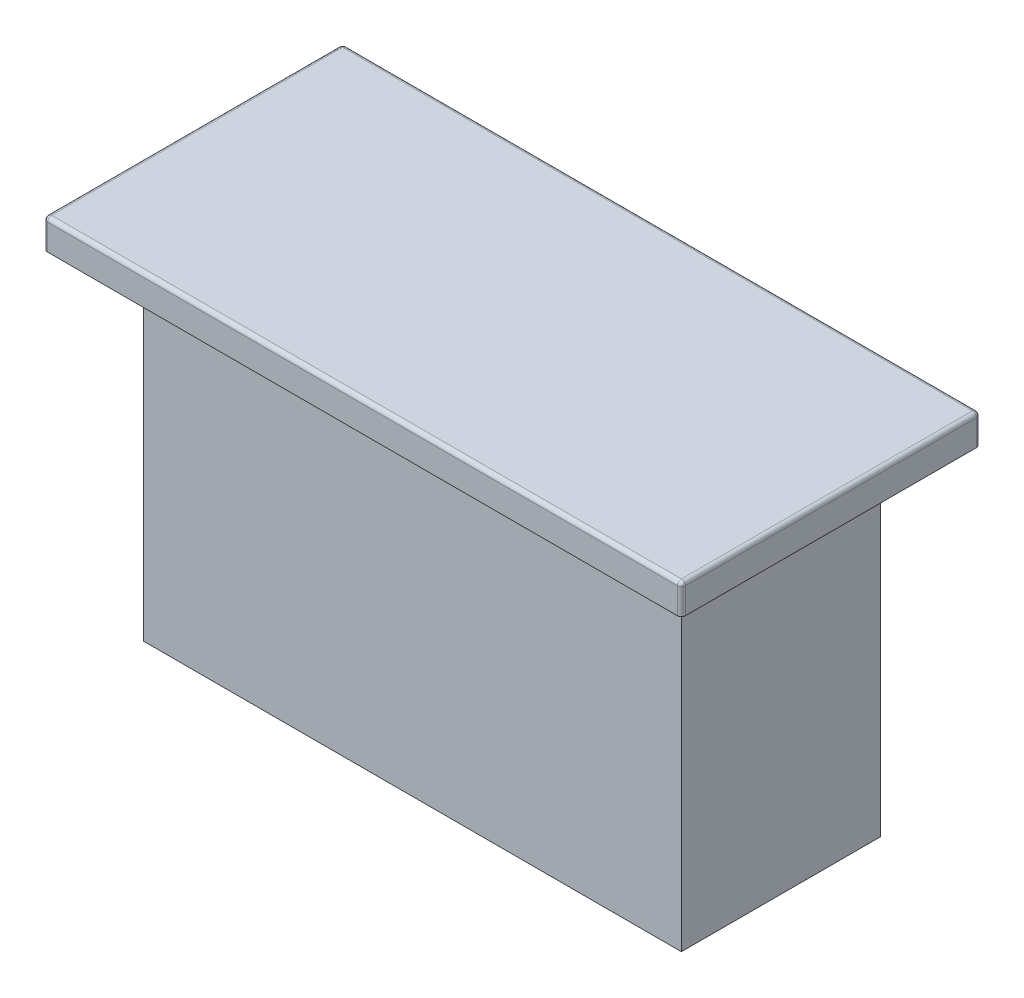
ISO-10303-21;
HEADER;
FILE_DESCRIPTION(('STEP AP214'),'2;1');
FILE_NAME('part.step','',(''),(''),'','','');
FILE_SCHEMA(('AUTOMOTIVE_DESIGN { 1 0 10303 214 1 1 1 1 }'));
ENDSEC;
DATA;
#1=APPLICATION_CONTEXT('core data for automotive mechanical design processes');
#2=APPLICATION_PROTOCOL_DEFINITION('international standard','automotive_design',2000,#1);
#3=PRODUCT_CONTEXT('',#1,'mechanical');
#4=PRODUCT('Part','Part','',(#3));
#5=PRODUCT_RELATED_PRODUCT_CATEGORY('part','',(#4));
#6=PRODUCT_DEFINITION_FORMATION('','',#4);
#7=PRODUCT_DEFINITION_CONTEXT('part definition',#1,'design');
#8=PRODUCT_DEFINITION('design','',#6,#7);
#9=PRODUCT_DEFINITION_SHAPE('','',#8);
#10=(LENGTH_UNIT() NAMED_UNIT(*) SI_UNIT(.MILLI.,.METRE.));
#11=(NAMED_UNIT(*) PLANE_ANGLE_UNIT() SI_UNIT($,.RADIAN.));
#12=(NAMED_UNIT(*) SI_UNIT($,.STERADIAN.) SOLID_ANGLE_UNIT());
#13=UNCERTAINTY_MEASURE_WITH_UNIT(LENGTH_MEASURE(1.E-05),#10,'distance_accuracy_value','');
#14=(GEOMETRIC_REPRESENTATION_CONTEXT(3) GLOBAL_UNCERTAINTY_ASSIGNED_CONTEXT((#13)) GLOBAL_UNIT_ASSIGNED_CONTEXT((#10,
#11,#12)) REPRESENTATION_CONTEXT('',''));
#15=CARTESIAN_POINT('',(0.,0.,0.));
#16=DIRECTION('',(0.,0.,1.));
#17=DIRECTION('',(1.,0.,0.));
#18=AXIS2_PLACEMENT_3D('',#15,#16,#17);
#19=CARTESIAN_POINT('',(0.,1.5,0.));
#20=DIRECTION('',(-1.,0.,0.));
#21=DIRECTION('',(0.,0.,1.));
#22=AXIS2_PLACEMENT_3D('',#19,#20,#21);
#23=PLANE('',#22);
#24=DIRECTION('',(0.,0.,-1.));
#25=VECTOR('',#24,1.);
#26=CARTESIAN_POINT('',(0.,0.,0.));
#27=LINE('',#26,#25);
#28=CARTESIAN_POINT('',(0.,0.,-0.2));
#29=VERTEX_POINT('',#28);
#30=CARTESIAN_POINT('',(0.,0.,-14.8));
#31=VERTEX_POINT('',#30);
#32=EDGE_CURVE('E166',#29,#31,#27,.T.);
#33=ORIENTED_EDGE('',*,*,#32,.T.);
#34=DIRECTION('',(0.,-1.,0.));
#35=VECTOR('',#34,1.);
#36=CARTESIAN_POINT('',(0.,1.5,-14.8));
#37=LINE('',#36,#35);
#38=CARTESIAN_POINT('',(0.,1.3,-14.8));
#39=VERTEX_POINT('',#38);
#40=EDGE_CURVE('E56',#31,#39,#37,.F.);
#41=ORIENTED_EDGE('',*,*,#40,.T.);
#42=DIRECTION('',(0.,0.,-1.));
#43=VECTOR('',#42,1.);
#44=CARTESIAN_POINT('',(0.,1.3,0.));
#45=LINE('',#44,#43);
#46=CARTESIAN_POINT('',(0.,1.3,-0.2));
#47=VERTEX_POINT('',#46);
#48=EDGE_CURVE('E208',#39,#47,#45,.F.);
#49=ORIENTED_EDGE('',*,*,#48,.T.);
#50=DIRECTION('',(0.,-1.,0.));
#51=VECTOR('',#50,1.);
#52=CARTESIAN_POINT('',(0.,1.5,-0.2));
#53=LINE('',#52,#51);
#54=EDGE_CURVE('E206',#47,#29,#53,.T.);
#55=ORIENTED_EDGE('',*,*,#54,.T.);
#56=EDGE_LOOP('',(#33,#41,#49,#55));
#57=FACE_BOUND('',#56,.T.);
#58=ADVANCED_FACE('F33',(#57),#23,.F.);
#59=CARTESIAN_POINT('',(0.,1.5,-15.));
#60=DIRECTION('',(0.,0.,1.));
#61=DIRECTION('',(1.,0.,0.));
#62=AXIS2_PLACEMENT_3D('',#59,#60,#61);
#63=PLANE('',#62);
#64=DIRECTION('',(-1.,0.,0.));
#65=VECTOR('',#64,1.);
#66=CARTESIAN_POINT('',(0.,0.,-15.));
#67=LINE('',#66,#65);
#68=CARTESIAN_POINT('',(-0.2,0.,-15.));
#69=VERTEX_POINT('',#68);
#70=CARTESIAN_POINT('',(-31.8,0.,-15.));
#71=VERTEX_POINT('',#70);
#72=EDGE_CURVE('E168',#69,#71,#67,.T.);
#73=ORIENTED_EDGE('',*,*,#72,.T.);
#74=DIRECTION('',(0.,-1.,0.));
#75=VECTOR('',#74,1.);
#76=CARTESIAN_POINT('',(-31.8,1.5,-15.));
#77=LINE('',#76,#75);
#78=CARTESIAN_POINT('',(-31.8,1.3,-15.));
#79=VERTEX_POINT('',#78);
#80=EDGE_CURVE('E204',#71,#79,#77,.F.);
#81=ORIENTED_EDGE('',*,*,#80,.T.);
#82=DIRECTION('',(-1.,0.,0.));
#83=VECTOR('',#82,1.);
#84=CARTESIAN_POINT('',(0.,1.3,-15.));
#85=LINE('',#84,#83);
#86=CARTESIAN_POINT('',(-0.2,1.3,-15.));
#87=VERTEX_POINT('',#86);
#88=EDGE_CURVE('E202',#79,#87,#85,.F.);
#89=ORIENTED_EDGE('',*,*,#88,.T.);
#90=DIRECTION('',(0.,-1.,0.));
#91=VECTOR('',#90,1.);
#92=CARTESIAN_POINT('',(-0.2,1.5,-15.));
#93=LINE('',#92,#91);
#94=EDGE_CURVE('E200',#87,#69,#93,.T.);
#95=ORIENTED_EDGE('',*,*,#94,.T.);
#96=EDGE_LOOP('',(#73,#81,#89,#95));
#97=FACE_BOUND('',#96,.T.);
#98=ADVANCED_FACE('F271',(#97),#63,.F.);
#99=CARTESIAN_POINT('',(-32.,1.5,0.));
#100=DIRECTION('',(1.,0.,0.));
#101=DIRECTION('',(0.,0.,-1.));
#102=AXIS2_PLACEMENT_3D('',#99,#100,#101);
#103=PLANE('',#102);
#104=DIRECTION('',(0.,0.,1.));
#105=VECTOR('',#104,1.);
#106=CARTESIAN_POINT('',(-32.,1.3,-15.));
#107=LINE('',#106,#105);
#108=CARTESIAN_POINT('',(-32.,1.3,-0.199999999999994));
#109=VERTEX_POINT('',#108);
#110=CARTESIAN_POINT('',(-32.,1.3,-14.8));
#111=VERTEX_POINT('',#110);
#112=EDGE_CURVE('E196',#109,#111,#107,.F.);
#113=ORIENTED_EDGE('',*,*,#112,.T.);
#114=DIRECTION('',(0.,-1.,0.));
#115=VECTOR('',#114,1.);
#116=CARTESIAN_POINT('',(-32.,1.5,-14.8));
#117=LINE('',#116,#115);
#118=CARTESIAN_POINT('',(-32.,0.,-14.8));
#119=VERTEX_POINT('',#118);
#120=EDGE_CURVE('E198',#111,#119,#117,.T.);
#121=ORIENTED_EDGE('',*,*,#120,.T.);
#122=DIRECTION('',(0.,0.,1.));
#123=VECTOR('',#122,1.);
#124=CARTESIAN_POINT('',(-32.,0.,0.));
#125=LINE('',#124,#123);
#126=CARTESIAN_POINT('',(-32.,0.,-0.199999999999994));
#127=VERTEX_POINT('',#126);
#128=EDGE_CURVE('E172',#119,#127,#125,.T.);
#129=ORIENTED_EDGE('',*,*,#128,.T.);
#130=DIRECTION('',(0.,-1.,0.));
#131=VECTOR('',#130,1.);
#132=CARTESIAN_POINT('',(-32.,1.5,-0.199999999999994));
#133=LINE('',#132,#131);
#134=EDGE_CURVE('E194',#127,#109,#133,.F.);
#135=ORIENTED_EDGE('',*,*,#134,.T.);
#136=EDGE_LOOP('',(#113,#121,#129,#135));
#137=FACE_BOUND('',#136,.T.);
#138=ADVANCED_FACE('F276',(#137),#103,.F.);
#139=CARTESIAN_POINT('',(0.,1.5,0.));
#140=DIRECTION('',(0.,0.,-1.));
#141=DIRECTION('',(-1.,0.,0.));
#142=AXIS2_PLACEMENT_3D('',#139,#140,#141);
#143=PLANE('',#142);
#144=DIRECTION('',(1.,0.,0.));
#145=VECTOR('',#144,1.);
#146=CARTESIAN_POINT('',(-32.,1.3,0.));
#147=LINE('',#146,#145);
#148=CARTESIAN_POINT('',(-0.2,1.3,0.));
#149=VERTEX_POINT('',#148);
#150=CARTESIAN_POINT('',(-31.8,1.3,0.));
#151=VERTEX_POINT('',#150);
#152=EDGE_CURVE('E189',#149,#151,#147,.F.);
#153=ORIENTED_EDGE('',*,*,#152,.T.);
#154=DIRECTION('',(0.,-1.,0.));
#155=VECTOR('',#154,1.);
#156=CARTESIAN_POINT('',(-31.8,1.5,0.));
#157=LINE('',#156,#155);
#158=CARTESIAN_POINT('',(-31.8,0.,0.));
#159=VERTEX_POINT('',#158);
#160=EDGE_CURVE('E192',#151,#159,#157,.T.);
#161=ORIENTED_EDGE('',*,*,#160,.T.);
#162=DIRECTION('',(1.,0.,0.));
#163=VECTOR('',#162,1.);
#164=CARTESIAN_POINT('',(0.,0.,0.));
#165=LINE('',#164,#163);
#166=CARTESIAN_POINT('',(-0.2,0.,0.));
#167=VERTEX_POINT('',#166);
#168=EDGE_CURVE('E175',#159,#167,#165,.T.);
#169=ORIENTED_EDGE('',*,*,#168,.T.);
#170=DIRECTION('',(0.,-1.,0.));
#171=VECTOR('',#170,1.);
#172=CARTESIAN_POINT('',(-0.2,1.5,0.));
#173=LINE('',#172,#171);
#174=EDGE_CURVE('E187',#167,#149,#173,.F.);
#175=ORIENTED_EDGE('',*,*,#174,.T.);
#176=EDGE_LOOP('',(#153,#161,#169,#175));
#177=FACE_BOUND('',#176,.T.);
#178=ADVANCED_FACE('F360',(#177),#143,.F.);
#179=CARTESIAN_POINT('',(0.,1.5,0.));
#180=DIRECTION('',(0.,1.,0.));
#181=DIRECTION('',(0.,0.,1.));
#182=AXIS2_PLACEMENT_3D('',#179,#180,#181);
#183=PLANE('',#182);
#184=DIRECTION('',(0.,0.,1.));
#185=VECTOR('',#184,1.);
#186=CARTESIAN_POINT('',(-31.8,1.5,0.));
#187=LINE('',#186,#185);
#188=CARTESIAN_POINT('',(-31.8,1.5,-14.8));
#189=VERTEX_POINT('',#188);
#190=CARTESIAN_POINT('',(-31.8,1.5,-0.199999999999994));
#191=VERTEX_POINT('',#190);
#192=EDGE_CURVE('E182',#189,#191,#187,.T.);
#193=ORIENTED_EDGE('',*,*,#192,.T.);
#194=DIRECTION('',(1.,0.,0.));
#195=VECTOR('',#194,1.);
#196=CARTESIAN_POINT('',(0.,1.5,-0.2));
#197=LINE('',#196,#195);
#198=CARTESIAN_POINT('',(-0.2,1.5,-0.2));
#199=VERTEX_POINT('',#198);
#200=EDGE_CURVE('E184',#191,#199,#197,.T.);
#201=ORIENTED_EDGE('',*,*,#200,.T.);
#202=DIRECTION('',(0.,0.,-1.));
#203=VECTOR('',#202,1.);
#204=CARTESIAN_POINT('',(-0.2,1.5,-15.));
#205=LINE('',#204,#203);
#206=CARTESIAN_POINT('',(-0.2,1.5,-14.8));
#207=VERTEX_POINT('',#206);
#208=EDGE_CURVE('E178',#199,#207,#205,.T.);
#209=ORIENTED_EDGE('',*,*,#208,.T.);
#210=DIRECTION('',(-1.,0.,0.));
#211=VECTOR('',#210,1.);
#212=CARTESIAN_POINT('',(-32.,1.5,-14.8));
#213=LINE('',#212,#211);
#214=EDGE_CURVE('E180',#207,#189,#213,.T.);
#215=ORIENTED_EDGE('',*,*,#214,.T.);
#216=EDGE_LOOP('',(#193,#201,#209,#215));
#217=FACE_BOUND('',#216,.T.);
#218=ADVANCED_FACE('F348',(#217),#183,.T.);
#219=CARTESIAN_POINT('',(0.,0.,0.));
#220=DIRECTION('',(0.,1.,0.));
#221=DIRECTION('',(0.,0.,1.));
#222=AXIS2_PLACEMENT_3D('',#219,#220,#221);
#223=PLANE('',#222);
#224=DIRECTION('',(0.,0.,-1.));
#225=VECTOR('',#224,1.);
#226=CARTESIAN_POINT('',(-2.5,0.,0.));
#227=LINE('',#226,#225);
#228=CARTESIAN_POINT('',(-2.5,0.,-2.5));
#229=VERTEX_POINT('',#228);
#230=CARTESIAN_POINT('',(-2.5,0.,-12.5));
#231=VERTEX_POINT('',#230);
#232=EDGE_CURVE('E41',#229,#231,#227,.T.);
#233=ORIENTED_EDGE('',*,*,#232,.T.);
#234=DIRECTION('',(-1.,0.,0.));
#235=VECTOR('',#234,1.);
#236=CARTESIAN_POINT('',(0.,0.,-12.5));
#237=LINE('',#236,#235);
#238=CARTESIAN_POINT('',(-29.5,0.,-12.5));
#239=VERTEX_POINT('',#238);
#240=EDGE_CURVE('E11',#231,#239,#237,.T.);
#241=ORIENTED_EDGE('',*,*,#240,.T.);
#242=DIRECTION('',(0.,0.,1.));
#243=VECTOR('',#242,1.);
#244=CARTESIAN_POINT('',(-29.5,0.,0.));
#245=LINE('',#244,#243);
#246=CARTESIAN_POINT('',(-29.5,0.,-2.49999999999999));
#247=VERTEX_POINT('',#246);
#248=EDGE_CURVE('E138',#239,#247,#245,.T.);
#249=ORIENTED_EDGE('',*,*,#248,.T.);
#250=DIRECTION('',(1.,0.,0.));
#251=VECTOR('',#250,1.);
#252=CARTESIAN_POINT('',(0.,0.,-2.5));
#253=LINE('',#252,#251);
#254=EDGE_CURVE('E252',#247,#229,#253,.T.);
#255=ORIENTED_EDGE('',*,*,#254,.T.);
#256=EDGE_LOOP('',(#233,#241,#249,#255));
#257=FACE_BOUND('',#256,.T.);
#258=ORIENTED_EDGE('',*,*,#128,.F.);
#259=CARTESIAN_POINT('',(-31.8,0.,-14.8));
#260=DIRECTION('',(0.,1.,0.));
#261=DIRECTION('',(0.,0.,1.));
#262=AXIS2_PLACEMENT_3D('',#259,#260,#261);
#263=CIRCLE('',#262,0.2);
#264=EDGE_CURVE('E217',#119,#71,#263,.F.);
#265=ORIENTED_EDGE('',*,*,#264,.T.);
#266=ORIENTED_EDGE('',*,*,#72,.F.);
#267=CARTESIAN_POINT('',(-0.2,0.,-14.8));
#268=DIRECTION('',(0.,1.,0.));
#269=DIRECTION('',(0.,0.,1.));
#270=AXIS2_PLACEMENT_3D('',#267,#268,#269);
#271=CIRCLE('',#270,0.2);
#272=EDGE_CURVE('E213',#69,#31,#271,.F.);
#273=ORIENTED_EDGE('',*,*,#272,.T.);
#274=ORIENTED_EDGE('',*,*,#32,.F.);
#275=CARTESIAN_POINT('',(-0.2,0.,-0.2));
#276=DIRECTION('',(0.,1.,0.));
#277=DIRECTION('',(0.,0.,1.));
#278=AXIS2_PLACEMENT_3D('',#275,#276,#277);
#279=CIRCLE('',#278,0.2);
#280=EDGE_CURVE('E211',#29,#167,#279,.F.);
#281=ORIENTED_EDGE('',*,*,#280,.T.);
#282=ORIENTED_EDGE('',*,*,#168,.F.);
#283=CARTESIAN_POINT('',(-31.8,0.,-0.199999999999994));
#284=DIRECTION('',(0.,1.,0.));
#285=DIRECTION('',(0.,0.,1.));
#286=AXIS2_PLACEMENT_3D('',#283,#284,#285);
#287=CIRCLE('',#286,0.2);
#288=EDGE_CURVE('E215',#159,#127,#287,.F.);
#289=ORIENTED_EDGE('',*,*,#288,.T.);
#290=EDGE_LOOP('',(#258,#265,#266,#273,#274,#281,#282,#289));
#291=FACE_BOUND('',#290,.T.);
#292=ADVANCED_FACE('F256',(#257,#291),#223,.F.);
#293=CARTESIAN_POINT('',(-31.8,1.5,-14.8));
#294=DIRECTION('',(0.,-1.,0.));
#295=DIRECTION('',(0.,0.,-1.));
#296=AXIS2_PLACEMENT_3D('',#293,#294,#295);
#297=CYLINDRICAL_SURFACE('',#296,0.2);
#298=ORIENTED_EDGE('',*,*,#264,.F.);
#299=ORIENTED_EDGE('',*,*,#120,.F.);
#300=CARTESIAN_POINT('',(-31.8,1.3,-14.8));
#301=DIRECTION('',(0.,1.,0.));
#302=DIRECTION('',(0.,0.,1.));
#303=AXIS2_PLACEMENT_3D('',#300,#301,#302);
#304=CIRCLE('',#303,0.2);
#305=EDGE_CURVE('E169',#79,#111,#304,.T.);
#306=ORIENTED_EDGE('',*,*,#305,.F.);
#307=ORIENTED_EDGE('',*,*,#80,.F.);
#308=EDGE_LOOP('',(#298,#299,#306,#307));
#309=FACE_BOUND('',#308,.T.);
#310=ADVANCED_FACE('F35',(#309),#297,.T.);
#311=CARTESIAN_POINT('',(0.,1.3,-14.8));
#312=DIRECTION('',(1.,0.,0.));
#313=DIRECTION('',(0.,0.,-1.));
#314=AXIS2_PLACEMENT_3D('',#311,#312,#313);
#315=CYLINDRICAL_SURFACE('',#314,0.2);
#316=CARTESIAN_POINT('',(-0.2,1.3,-14.8));
#317=DIRECTION('',(1.,0.,0.));
#318=DIRECTION('',(0.,0.,-1.));
#319=AXIS2_PLACEMENT_3D('',#316,#317,#318);
#320=CIRCLE('',#319,0.2);
#321=EDGE_CURVE('E243',#87,#207,#320,.T.);
#322=ORIENTED_EDGE('',*,*,#321,.F.);
#323=ORIENTED_EDGE('',*,*,#88,.F.);
#324=CARTESIAN_POINT('',(-31.8,1.3,-14.8));
#325=DIRECTION('',(-1.,0.,0.));
#326=DIRECTION('',(0.,0.,1.));
#327=AXIS2_PLACEMENT_3D('',#324,#325,#326);
#328=CIRCLE('',#327,0.2);
#329=EDGE_CURVE('E246',#189,#79,#328,.T.);
#330=ORIENTED_EDGE('',*,*,#329,.F.);
#331=ORIENTED_EDGE('',*,*,#214,.F.);
#332=EDGE_LOOP('',(#322,#323,#330,#331));
#333=FACE_BOUND('',#332,.T.);
#334=ADVANCED_FACE('F319',(#333),#315,.T.);
#335=CARTESIAN_POINT('',(-0.2,1.5,-14.8));
#336=DIRECTION('',(0.,-1.,0.));
#337=DIRECTION('',(0.,0.,-1.));
#338=AXIS2_PLACEMENT_3D('',#335,#336,#337);
#339=CYLINDRICAL_SURFACE('',#338,0.2);
#340=ORIENTED_EDGE('',*,*,#272,.F.);
#341=ORIENTED_EDGE('',*,*,#94,.F.);
#342=CARTESIAN_POINT('',(-0.2,1.3,-14.8));
#343=DIRECTION('',(0.,1.,0.));
#344=DIRECTION('',(0.,0.,1.));
#345=AXIS2_PLACEMENT_3D('',#342,#343,#344);
#346=CIRCLE('',#345,0.2);
#347=EDGE_CURVE('E240',#39,#87,#346,.T.);
#348=ORIENTED_EDGE('',*,*,#347,.F.);
#349=ORIENTED_EDGE('',*,*,#40,.F.);
#350=EDGE_LOOP('',(#340,#341,#348,#349));
#351=FACE_BOUND('',#350,.T.);
#352=ADVANCED_FACE('F316',(#351),#339,.T.);
#353=CARTESIAN_POINT('',(-31.8,1.3,-14.8));
#354=DIRECTION('',(0.,0.,1.));
#355=DIRECTION('',(1.,0.,0.));
#356=AXIS2_PLACEMENT_3D('',#353,#354,#355);
#357=SPHERICAL_SURFACE('',#356,0.2);
#358=ORIENTED_EDGE('',*,*,#329,.T.);
#359=ORIENTED_EDGE('',*,*,#305,.T.);
#360=CARTESIAN_POINT('',(-31.8,1.3,-14.8));
#361=DIRECTION('',(0.,0.,-1.));
#362=DIRECTION('',(-1.,0.,0.));
#363=AXIS2_PLACEMENT_3D('',#360,#361,#362);
#364=CIRCLE('',#363,0.2);
#365=EDGE_CURVE('E237',#189,#111,#364,.F.);
#366=ORIENTED_EDGE('',*,*,#365,.F.);
#367=EDGE_LOOP('',(#358,#359,#366));
#368=FACE_BOUND('',#367,.T.);
#369=ADVANCED_FACE('F312',(#368),#357,.T.);
#370=CARTESIAN_POINT('',(-0.2,1.3,-14.8));
#371=DIRECTION('',(0.,0.,1.));
#372=DIRECTION('',(1.,0.,0.));
#373=AXIS2_PLACEMENT_3D('',#370,#371,#372);
#374=SPHERICAL_SURFACE('',#373,0.2);
#375=ORIENTED_EDGE('',*,*,#347,.T.);
#376=ORIENTED_EDGE('',*,*,#321,.T.);
#377=CARTESIAN_POINT('',(-0.2,1.3,-14.8));
#378=DIRECTION('',(0.,0.,-1.));
#379=DIRECTION('',(-1.,0.,0.));
#380=AXIS2_PLACEMENT_3D('',#377,#378,#379);
#381=CIRCLE('',#380,0.2);
#382=EDGE_CURVE('E234',#39,#207,#381,.F.);
#383=ORIENTED_EDGE('',*,*,#382,.F.);
#384=EDGE_LOOP('',(#375,#376,#383));
#385=FACE_BOUND('',#384,.T.);
#386=ADVANCED_FACE('F308',(#385),#374,.T.);
#387=CARTESIAN_POINT('',(-31.8,1.5,-0.199999999999994));
#388=DIRECTION('',(0.,-1.,0.));
#389=DIRECTION('',(0.,0.,-1.));
#390=AXIS2_PLACEMENT_3D('',#387,#388,#389);
#391=CYLINDRICAL_SURFACE('',#390,0.2);
#392=ORIENTED_EDGE('',*,*,#288,.F.);
#393=ORIENTED_EDGE('',*,*,#160,.F.);
#394=CARTESIAN_POINT('',(-31.8,1.3,-0.199999999999994));
#395=DIRECTION('',(0.,1.,0.));
#396=DIRECTION('',(0.,0.,1.));
#397=AXIS2_PLACEMENT_3D('',#394,#395,#396);
#398=CIRCLE('',#397,0.2);
#399=EDGE_CURVE('E231',#109,#151,#398,.T.);
#400=ORIENTED_EDGE('',*,*,#399,.F.);
#401=ORIENTED_EDGE('',*,*,#134,.F.);
#402=EDGE_LOOP('',(#392,#393,#400,#401));
#403=FACE_BOUND('',#402,.T.);
#404=ADVANCED_FACE('F304',(#403),#391,.T.);
#405=CARTESIAN_POINT('',(-31.8,1.3,0.));
#406=DIRECTION('',(0.,0.,-1.));
#407=DIRECTION('',(-1.,0.,0.));
#408=AXIS2_PLACEMENT_3D('',#405,#406,#407);
#409=CYLINDRICAL_SURFACE('',#408,0.2);
#410=ORIENTED_EDGE('',*,*,#365,.T.);
#411=ORIENTED_EDGE('',*,*,#112,.F.);
#412=CARTESIAN_POINT('',(-31.8,1.3,-0.199999999999994));
#413=DIRECTION('',(0.,0.,1.));
#414=DIRECTION('',(1.,0.,0.));
#415=AXIS2_PLACEMENT_3D('',#412,#413,#414);
#416=CIRCLE('',#415,0.2);
#417=EDGE_CURVE('E228',#191,#109,#416,.T.);
#418=ORIENTED_EDGE('',*,*,#417,.F.);
#419=ORIENTED_EDGE('',*,*,#192,.F.);
#420=EDGE_LOOP('',(#410,#411,#418,#419));
#421=FACE_BOUND('',#420,.T.);
#422=ADVANCED_FACE('F300',(#421),#409,.T.);
#423=CARTESIAN_POINT('',(-0.2,1.3,0.));
#424=DIRECTION('',(0.,0.,1.));
#425=DIRECTION('',(1.,0.,0.));
#426=AXIS2_PLACEMENT_3D('',#423,#424,#425);
#427=CYLINDRICAL_SURFACE('',#426,0.2);
#428=ORIENTED_EDGE('',*,*,#382,.T.);
#429=ORIENTED_EDGE('',*,*,#208,.F.);
#430=CARTESIAN_POINT('',(-0.2,1.3,-0.2));
#431=DIRECTION('',(0.,0.,1.));
#432=DIRECTION('',(1.,0.,0.));
#433=AXIS2_PLACEMENT_3D('',#430,#431,#432);
#434=CIRCLE('',#433,0.2);
#435=EDGE_CURVE('E225',#47,#199,#434,.T.);
#436=ORIENTED_EDGE('',*,*,#435,.F.);
#437=ORIENTED_EDGE('',*,*,#48,.F.);
#438=EDGE_LOOP('',(#428,#429,#436,#437));
#439=FACE_BOUND('',#438,.T.);
#440=ADVANCED_FACE('F296',(#439),#427,.T.);
#441=CARTESIAN_POINT('',(-0.2,1.5,-0.2));
#442=DIRECTION('',(0.,-1.,0.));
#443=DIRECTION('',(0.,0.,-1.));
#444=AXIS2_PLACEMENT_3D('',#441,#442,#443);
#445=CYLINDRICAL_SURFACE('',#444,0.2);
#446=ORIENTED_EDGE('',*,*,#280,.F.);
#447=ORIENTED_EDGE('',*,*,#54,.F.);
#448=CARTESIAN_POINT('',(-0.2,1.3,-0.2));
#449=DIRECTION('',(0.,1.,0.));
#450=DIRECTION('',(0.,0.,1.));
#451=AXIS2_PLACEMENT_3D('',#448,#449,#450);
#452=CIRCLE('',#451,0.2);
#453=EDGE_CURVE('E222',#149,#47,#452,.T.);
#454=ORIENTED_EDGE('',*,*,#453,.F.);
#455=ORIENTED_EDGE('',*,*,#174,.F.);
#456=EDGE_LOOP('',(#446,#447,#454,#455));
#457=FACE_BOUND('',#456,.T.);
#458=ADVANCED_FACE('F292',(#457),#445,.T.);
#459=CARTESIAN_POINT('',(-31.8,1.3,-0.199999999999994));
#460=DIRECTION('',(0.,0.,1.));
#461=DIRECTION('',(1.,0.,0.));
#462=AXIS2_PLACEMENT_3D('',#459,#460,#461);
#463=SPHERICAL_SURFACE('',#462,0.2);
#464=ORIENTED_EDGE('',*,*,#417,.T.);
#465=ORIENTED_EDGE('',*,*,#399,.T.);
#466=CARTESIAN_POINT('',(-31.8,1.3,-0.199999999999994));
#467=DIRECTION('',(-1.,0.,0.));
#468=DIRECTION('',(0.,0.,1.));
#469=AXIS2_PLACEMENT_3D('',#466,#467,#468);
#470=CIRCLE('',#469,0.2);
#471=EDGE_CURVE('E220',#191,#151,#470,.F.);
#472=ORIENTED_EDGE('',*,*,#471,.F.);
#473=EDGE_LOOP('',(#464,#465,#472));
#474=FACE_BOUND('',#473,.T.);
#475=ADVANCED_FACE('F288',(#474),#463,.T.);
#476=CARTESIAN_POINT('',(-0.2,1.3,-0.2));
#477=DIRECTION('',(0.,0.,1.));
#478=DIRECTION('',(1.,0.,0.));
#479=AXIS2_PLACEMENT_3D('',#476,#477,#478);
#480=SPHERICAL_SURFACE('',#479,0.2);
#481=ORIENTED_EDGE('',*,*,#453,.T.);
#482=ORIENTED_EDGE('',*,*,#435,.T.);
#483=CARTESIAN_POINT('',(-0.2,1.3,-0.2));
#484=DIRECTION('',(1.,0.,0.));
#485=DIRECTION('',(0.,0.,-1.));
#486=AXIS2_PLACEMENT_3D('',#483,#484,#485);
#487=CIRCLE('',#486,0.2);
#488=EDGE_CURVE('E161',#149,#199,#487,.F.);
#489=ORIENTED_EDGE('',*,*,#488,.F.);
#490=EDGE_LOOP('',(#481,#482,#489));
#491=FACE_BOUND('',#490,.T.);
#492=ADVANCED_FACE('F284',(#491),#480,.T.);
#493=CARTESIAN_POINT('',(0.,1.3,-0.2));
#494=DIRECTION('',(-1.,0.,0.));
#495=DIRECTION('',(0.,0.,1.));
#496=AXIS2_PLACEMENT_3D('',#493,#494,#495);
#497=CYLINDRICAL_SURFACE('',#496,0.2);
#498=ORIENTED_EDGE('',*,*,#471,.T.);
#499=ORIENTED_EDGE('',*,*,#152,.F.);
#500=ORIENTED_EDGE('',*,*,#488,.T.);
#501=ORIENTED_EDGE('',*,*,#200,.F.);
#502=EDGE_LOOP('',(#498,#499,#500,#501));
#503=FACE_BOUND('',#502,.T.);
#504=ADVANCED_FACE('F281',(#503),#497,.T.);
#505=CARTESIAN_POINT('',(-2.5,-17.,-12.5));
#506=DIRECTION('',(0.,0.,-1.));
#507=DIRECTION('',(-1.,0.,0.));
#508=AXIS2_PLACEMENT_3D('',#505,#506,#507);
#509=PLANE('',#508);
#510=ORIENTED_EDGE('',*,*,#240,.F.);
#511=DIRECTION('',(0.,1.,0.));
#512=VECTOR('',#511,1.);
#513=CARTESIAN_POINT('',(-2.5,-17.,-12.5));
#514=LINE('',#513,#512);
#515=CARTESIAN_POINT('',(-2.5,-17.,-12.5));
#516=VERTEX_POINT('',#515);
#517=EDGE_CURVE('E155',#516,#231,#514,.T.);
#518=ORIENTED_EDGE('',*,*,#517,.F.);
#519=DIRECTION('',(-1.,0.,0.));
#520=VECTOR('',#519,1.);
#521=CARTESIAN_POINT('',(-2.5,-17.,-12.5));
#522=LINE('',#521,#520);
#523=CARTESIAN_POINT('',(-29.5,-17.,-12.5));
#524=VERTEX_POINT('',#523);
#525=EDGE_CURVE('E148',#516,#524,#522,.T.);
#526=ORIENTED_EDGE('',*,*,#525,.T.);
#527=DIRECTION('',(0.,1.,0.));
#528=VECTOR('',#527,1.);
#529=CARTESIAN_POINT('',(-29.5,-17.,-12.5));
#530=LINE('',#529,#528);
#531=EDGE_CURVE('E133',#524,#239,#530,.T.);
#532=ORIENTED_EDGE('',*,*,#531,.T.);
#533=EDGE_LOOP('',(#510,#518,#526,#532));
#534=FACE_BOUND('',#533,.T.);
#535=ADVANCED_FACE('F153',(#534),#509,.T.);
#536=CARTESIAN_POINT('',(-2.5,-17.,-2.5));
#537=DIRECTION('',(1.,0.,0.));
#538=DIRECTION('',(0.,0.,-1.));
#539=AXIS2_PLACEMENT_3D('',#536,#537,#538);
#540=PLANE('',#539);
#541=ORIENTED_EDGE('',*,*,#232,.F.);
#542=DIRECTION('',(0.,1.,0.));
#543=VECTOR('',#542,1.);
#544=CARTESIAN_POINT('',(-2.5,-17.,-2.5));
#545=LINE('',#544,#543);
#546=CARTESIAN_POINT('',(-2.5,-17.,-2.5));
#547=VERTEX_POINT('',#546);
#548=EDGE_CURVE('E162',#547,#229,#545,.T.);
#549=ORIENTED_EDGE('',*,*,#548,.F.);
#550=DIRECTION('',(0.,0.,-1.));
#551=VECTOR('',#550,1.);
#552=CARTESIAN_POINT('',(-2.5,-17.,-2.5));
#553=LINE('',#552,#551);
#554=EDGE_CURVE('E141',#547,#516,#553,.T.);
#555=ORIENTED_EDGE('',*,*,#554,.T.);
#556=ORIENTED_EDGE('',*,*,#517,.T.);
#557=EDGE_LOOP('',(#541,#549,#555,#556));
#558=FACE_BOUND('',#557,.T.);
#559=ADVANCED_FACE('F259',(#558),#540,.T.);
#560=CARTESIAN_POINT('',(-29.5,-17.,-2.49999999999999));
#561=DIRECTION('',(0.,0.,1.));
#562=DIRECTION('',(1.,0.,0.));
#563=AXIS2_PLACEMENT_3D('',#560,#561,#562);
#564=PLANE('',#563);
#565=ORIENTED_EDGE('',*,*,#254,.F.);
#566=DIRECTION('',(0.,1.,0.));
#567=VECTOR('',#566,1.);
#568=CARTESIAN_POINT('',(-29.5,-17.,-2.49999999999999));
#569=LINE('',#568,#567);
#570=CARTESIAN_POINT('',(-29.5,-17.,-2.49999999999999));
#571=VERTEX_POINT('',#570);
#572=EDGE_CURVE('E48',#571,#247,#569,.T.);
#573=ORIENTED_EDGE('',*,*,#572,.F.);
#574=DIRECTION('',(1.,0.,0.));
#575=VECTOR('',#574,1.);
#576=CARTESIAN_POINT('',(-29.5,-17.,-2.49999999999999));
#577=LINE('',#576,#575);
#578=EDGE_CURVE('E151',#571,#547,#577,.T.);
#579=ORIENTED_EDGE('',*,*,#578,.T.);
#580=ORIENTED_EDGE('',*,*,#548,.T.);
#581=EDGE_LOOP('',(#565,#573,#579,#580));
#582=FACE_BOUND('',#581,.T.);
#583=ADVANCED_FACE('F261',(#582),#564,.T.);
#584=CARTESIAN_POINT('',(-29.5,-17.,-12.5));
#585=DIRECTION('',(-1.,0.,0.));
#586=DIRECTION('',(0.,0.,1.));
#587=AXIS2_PLACEMENT_3D('',#584,#585,#586);
#588=PLANE('',#587);
#589=ORIENTED_EDGE('',*,*,#248,.F.);
#590=ORIENTED_EDGE('',*,*,#531,.F.);
#591=DIRECTION('',(0.,0.,1.));
#592=VECTOR('',#591,1.);
#593=CARTESIAN_POINT('',(-29.5,-17.,-12.5));
#594=LINE('',#593,#592);
#595=EDGE_CURVE('E136',#524,#571,#594,.T.);
#596=ORIENTED_EDGE('',*,*,#595,.T.);
#597=ORIENTED_EDGE('',*,*,#572,.T.);
#598=EDGE_LOOP('',(#589,#590,#596,#597));
#599=FACE_BOUND('',#598,.T.);
#600=ADVANCED_FACE('F135',(#599),#588,.T.);
#601=CARTESIAN_POINT('',(0.,-17.,0.));
#602=DIRECTION('',(0.,1.,0.));
#603=DIRECTION('',(0.,0.,1.));
#604=AXIS2_PLACEMENT_3D('',#601,#602,#603);
#605=PLANE('',#604);
#606=ORIENTED_EDGE('',*,*,#525,.F.);
#607=ORIENTED_EDGE('',*,*,#554,.F.);
#608=ORIENTED_EDGE('',*,*,#578,.F.);
#609=ORIENTED_EDGE('',*,*,#595,.F.);
#610=EDGE_LOOP('',(#606,#607,#608,#609));
#611=FACE_BOUND('',#610,.T.);
#612=ADVANCED_FACE('F146',(#611),#605,.F.);
#613=CLOSED_SHELL('',(#58,#98,#138,#178,#218,#292,#310,#334,#352,#369,#386,#404,#422,#440,#458,
#475,#492,#504,#535,#559,#583,#600,#612));
#614=MANIFOLD_SOLID_BREP('B2',#613);
#615=ADVANCED_BREP_SHAPE_REPRESENTATION('',(#18,#614),#14);
#616=SHAPE_DEFINITION_REPRESENTATION(#9,#615);
ENDSEC;
END-ISO-10303-21;
